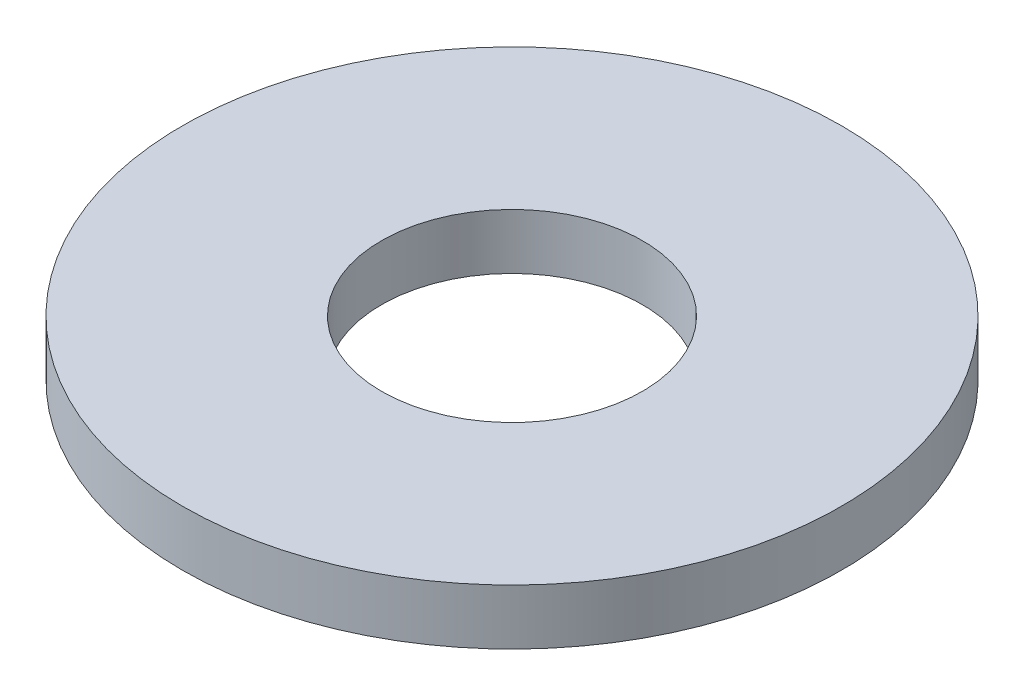
ISO-10303-21;
HEADER;
FILE_DESCRIPTION(('STEP AP214'),'2;1');
FILE_NAME('part.step','',(''),(''),'','','');
FILE_SCHEMA(('AUTOMOTIVE_DESIGN { 1 0 10303 214 1 1 1 1 }'));
ENDSEC;
DATA;
#1=APPLICATION_CONTEXT('core data for automotive mechanical design processes');
#2=APPLICATION_PROTOCOL_DEFINITION('international standard','automotive_design',2000,#1);
#3=PRODUCT_CONTEXT('',#1,'mechanical');
#4=PRODUCT('Part','Part','',(#3));
#5=PRODUCT_RELATED_PRODUCT_CATEGORY('part','',(#4));
#6=PRODUCT_DEFINITION_FORMATION('','',#4);
#7=PRODUCT_DEFINITION_CONTEXT('part definition',#1,'design');
#8=PRODUCT_DEFINITION('design','',#6,#7);
#9=PRODUCT_DEFINITION_SHAPE('','',#8);
#10=(LENGTH_UNIT() NAMED_UNIT(*) SI_UNIT(.MILLI.,.METRE.));
#11=(NAMED_UNIT(*) PLANE_ANGLE_UNIT() SI_UNIT($,.RADIAN.));
#12=(NAMED_UNIT(*) SI_UNIT($,.STERADIAN.) SOLID_ANGLE_UNIT());
#13=UNCERTAINTY_MEASURE_WITH_UNIT(LENGTH_MEASURE(1.E-05),#10,'distance_accuracy_value','');
#14=(GEOMETRIC_REPRESENTATION_CONTEXT(3) GLOBAL_UNCERTAINTY_ASSIGNED_CONTEXT((#13)) GLOBAL_UNIT_ASSIGNED_CONTEXT((#10,
#11,#12)) REPRESENTATION_CONTEXT('',''));
#15=CARTESIAN_POINT('',(0.,0.,0.));
#16=DIRECTION('',(0.,0.,1.));
#17=DIRECTION('',(1.,0.,0.));
#18=AXIS2_PLACEMENT_3D('',#15,#16,#17);
#19=CARTESIAN_POINT('',(0.,0.85,0.));
#20=DIRECTION('',(0.,1.,0.));
#21=DIRECTION('',(0.,0.,1.));
#22=AXIS2_PLACEMENT_3D('',#19,#20,#21);
#23=PLANE('',#22);
#24=CARTESIAN_POINT('',(0.,0.85,0.));
#25=DIRECTION('',(0.,1.,0.));
#26=DIRECTION('',(0.,0.,1.));
#27=AXIS2_PLACEMENT_3D('',#24,#25,#26);
#28=CIRCLE('',#27,5.05);
#29=CARTESIAN_POINT('',(0.,0.85,5.05));
#30=VERTEX_POINT('',#29);
#31=EDGE_CURVE('E10',#30,#30,#28,.T.);
#32=ORIENTED_EDGE('',*,*,#31,.T.);
#33=EDGE_LOOP('',(#32));
#34=FACE_BOUND('',#33,.T.);
#35=CARTESIAN_POINT('',(0.,0.85,0.));
#36=DIRECTION('',(0.,1.,0.));
#37=DIRECTION('',(0.,0.,1.));
#38=AXIS2_PLACEMENT_3D('',#35,#36,#37);
#39=CIRCLE('',#38,2.);
#40=CARTESIAN_POINT('',(0.,0.85,2.));
#41=VERTEX_POINT('',#40);
#42=EDGE_CURVE('E41',#41,#41,#39,.T.);
#43=ORIENTED_EDGE('',*,*,#42,.F.);
#44=EDGE_LOOP('',(#43));
#45=FACE_BOUND('',#44,.T.);
#46=ADVANCED_FACE('F30',(#34,#45),#23,.T.);
#47=CARTESIAN_POINT('',(0.,0.,0.));
#48=DIRECTION('',(0.,1.,0.));
#49=DIRECTION('',(0.,0.,1.));
#50=AXIS2_PLACEMENT_3D('',#47,#48,#49);
#51=PLANE('',#50);
#52=CARTESIAN_POINT('',(0.,0.,0.));
#53=DIRECTION('',(0.,1.,0.));
#54=DIRECTION('',(0.,0.,1.));
#55=AXIS2_PLACEMENT_3D('',#52,#53,#54);
#56=CIRCLE('',#55,5.05);
#57=CARTESIAN_POINT('',(0.,0.,5.05));
#58=VERTEX_POINT('',#57);
#59=EDGE_CURVE('E34',#58,#58,#56,.T.);
#60=ORIENTED_EDGE('',*,*,#59,.F.);
#61=EDGE_LOOP('',(#60));
#62=FACE_BOUND('',#61,.T.);
#63=CARTESIAN_POINT('',(0.,0.,0.));
#64=DIRECTION('',(0.,1.,0.));
#65=DIRECTION('',(0.,0.,1.));
#66=AXIS2_PLACEMENT_3D('',#63,#64,#65);
#67=CIRCLE('',#66,2.);
#68=CARTESIAN_POINT('',(0.,0.,2.));
#69=VERTEX_POINT('',#68);
#70=EDGE_CURVE('E43',#69,#69,#67,.T.);
#71=ORIENTED_EDGE('',*,*,#70,.T.);
#72=EDGE_LOOP('',(#71));
#73=FACE_BOUND('',#72,.T.);
#74=ADVANCED_FACE('F53',(#62,#73),#51,.F.);
#75=CARTESIAN_POINT('',(0.,0.85,0.));
#76=DIRECTION('',(0.,-1.,0.));
#77=DIRECTION('',(0.,0.,-1.));
#78=AXIS2_PLACEMENT_3D('',#75,#76,#77);
#79=CYLINDRICAL_SURFACE('',#78,5.05);
#80=ORIENTED_EDGE('',*,*,#31,.F.);
#81=EDGE_LOOP('',(#80));
#82=FACE_BOUND('',#81,.T.);
#83=ORIENTED_EDGE('',*,*,#59,.T.);
#84=EDGE_LOOP('',(#83));
#85=FACE_BOUND('',#84,.T.);
#86=ADVANCED_FACE('F32',(#82,#85),#79,.T.);
#87=CARTESIAN_POINT('',(0.,0.85,0.));
#88=DIRECTION('',(0.,-1.,0.));
#89=DIRECTION('',(0.,0.,-1.));
#90=AXIS2_PLACEMENT_3D('',#87,#88,#89);
#91=CYLINDRICAL_SURFACE('',#90,2.);
#92=ORIENTED_EDGE('',*,*,#42,.T.);
#93=EDGE_LOOP('',(#92));
#94=FACE_BOUND('',#93,.T.);
#95=ORIENTED_EDGE('',*,*,#70,.F.);
#96=EDGE_LOOP('',(#95));
#97=FACE_BOUND('',#96,.T.);
#98=ADVANCED_FACE('F49',(#94,#97),#91,.F.);
#99=CLOSED_SHELL('',(#46,#74,#86,#98));
#100=MANIFOLD_SOLID_BREP('B2',#99);
#101=ADVANCED_BREP_SHAPE_REPRESENTATION('',(#18,#100),#14);
#102=SHAPE_DEFINITION_REPRESENTATION(#9,#101);
ENDSEC;
END-ISO-10303-21;
